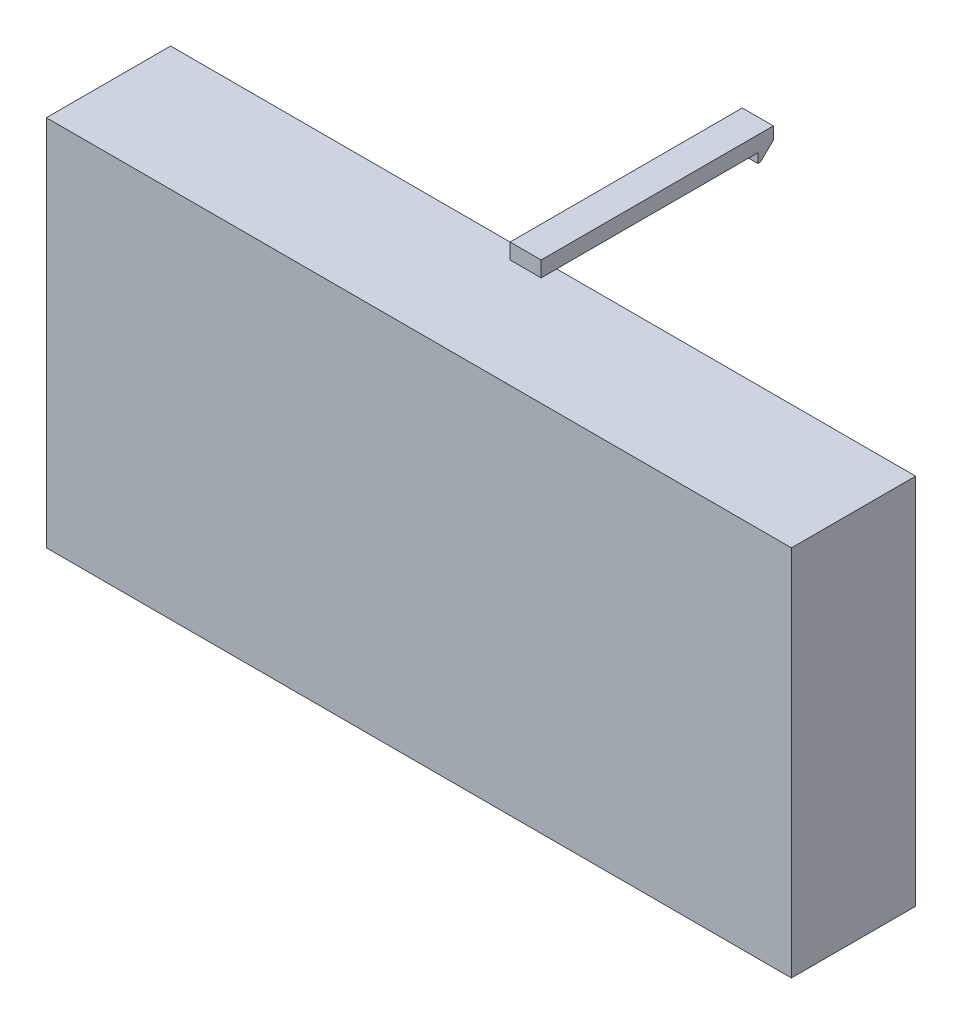
ISO-10303-21;
HEADER;
FILE_DESCRIPTION(('STEP AP214'),'2;1');
FILE_NAME('part.step','',(''),(''),'','','');
FILE_SCHEMA(('AUTOMOTIVE_DESIGN { 1 0 10303 214 1 1 1 1 }'));
ENDSEC;
DATA;
#1=APPLICATION_CONTEXT('core data for automotive mechanical design processes');
#2=APPLICATION_PROTOCOL_DEFINITION('international standard','automotive_design',2000,#1);
#3=PRODUCT_CONTEXT('',#1,'mechanical');
#4=PRODUCT('Part','Part','',(#3));
#5=PRODUCT_RELATED_PRODUCT_CATEGORY('part','',(#4));
#6=PRODUCT_DEFINITION_FORMATION('','',#4);
#7=PRODUCT_DEFINITION_CONTEXT('part definition',#1,'design');
#8=PRODUCT_DEFINITION('design','',#6,#7);
#9=PRODUCT_DEFINITION_SHAPE('','',#8);
#10=(LENGTH_UNIT() NAMED_UNIT(*) SI_UNIT(.MILLI.,.METRE.));
#11=(NAMED_UNIT(*) PLANE_ANGLE_UNIT() SI_UNIT($,.RADIAN.));
#12=(NAMED_UNIT(*) SI_UNIT($,.STERADIAN.) SOLID_ANGLE_UNIT());
#13=UNCERTAINTY_MEASURE_WITH_UNIT(LENGTH_MEASURE(1.E-05),#10,'distance_accuracy_value','');
#14=(GEOMETRIC_REPRESENTATION_CONTEXT(3) GLOBAL_UNCERTAINTY_ASSIGNED_CONTEXT((#13)) GLOBAL_UNIT_ASSIGNED_CONTEXT((#10,
#11,#12)) REPRESENTATION_CONTEXT('',''));
#15=CARTESIAN_POINT('',(0.,0.,0.));
#16=DIRECTION('',(0.,0.,1.));
#17=DIRECTION('',(1.,0.,0.));
#18=AXIS2_PLACEMENT_3D('',#15,#16,#17);
#19=CARTESIAN_POINT('',(157.949627363011,-6.35000000000003,0.));
#20=DIRECTION('',(1.,0.,0.));
#21=DIRECTION('',(0.,1.,0.));
#22=AXIS2_PLACEMENT_3D('',#19,#20,#21);
#23=PLANE('',#22);
#24=DIRECTION('',(0.,1.,0.));
#25=VECTOR('',#24,1.);
#26=CARTESIAN_POINT('',(157.949627363011,-6.35000000000002,-88.646));
#27=LINE('',#26,#25);
#28=CARTESIAN_POINT('',(157.949627363011,-6.35000000000002,-88.646));
#29=VERTEX_POINT('',#28);
#30=CARTESIAN_POINT('',(157.949627363011,-1.27000000000002,-88.646));
#31=VERTEX_POINT('',#30);
#32=EDGE_CURVE('E225',#29,#31,#27,.T.);
#33=ORIENTED_EDGE('',*,*,#32,.T.);
#34=DIRECTION('',(0.,0.694658370458993,0.719339800338655));
#35=VECTOR('',#34,1.);
#36=CARTESIAN_POINT('',(157.949627363011,3.80999999999998,-83.3855060059439));
#37=LINE('',#36,#35);
#38=CARTESIAN_POINT('',(157.949627363011,3.80999999999998,-83.3855060059439));
#39=VERTEX_POINT('',#38);
#40=EDGE_CURVE('E208',#31,#39,#37,.T.);
#41=ORIENTED_EDGE('',*,*,#40,.T.);
#42=DIRECTION('',(0.,0.,1.));
#43=VECTOR('',#42,1.);
#44=CARTESIAN_POINT('',(157.949627363011,3.80999999999997,-88.646));
#45=LINE('',#44,#43);
#46=CARTESIAN_POINT('',(157.949627363011,3.80999999999997,-82.296));
#47=VERTEX_POINT('',#46);
#48=EDGE_CURVE('E218',#39,#47,#45,.T.);
#49=ORIENTED_EDGE('',*,*,#48,.T.);
#50=DIRECTION('',(0.,-1.,0.));
#51=VECTOR('',#50,1.);
#52=CARTESIAN_POINT('',(157.949627363011,3.80999999999997,-82.296));
#53=LINE('',#52,#51);
#54=CARTESIAN_POINT('',(157.949627363011,0.,-82.296));
#55=VERTEX_POINT('',#54);
#56=EDGE_CURVE('E228',#47,#55,#53,.T.);
#57=ORIENTED_EDGE('',*,*,#56,.T.);
#58=DIRECTION('',(0.,0.,1.));
#59=VECTOR('',#58,1.);
#60=CARTESIAN_POINT('',(157.949627363011,0.,-88.646));
#61=LINE('',#60,#59);
#62=CARTESIAN_POINT('',(157.949627363011,0.,0.));
#63=VERTEX_POINT('',#62);
#64=EDGE_CURVE('E251',#55,#63,#61,.T.);
#65=ORIENTED_EDGE('',*,*,#64,.T.);
#66=DIRECTION('',(0.,0.,-1.));
#67=VECTOR('',#66,1.);
#68=CARTESIAN_POINT('',(157.949627363011,0.,0.));
#69=LINE('',#68,#67);
#70=CARTESIAN_POINT('',(157.949627363011,0.,6.35000000000003));
#71=VERTEX_POINT('',#70);
#72=EDGE_CURVE('E276',#71,#63,#69,.T.);
#73=ORIENTED_EDGE('',*,*,#72,.F.);
#74=DIRECTION('',(0.,1.,0.));
#75=VECTOR('',#74,1.);
#76=CARTESIAN_POINT('',(157.949627363011,-6.35000000000003,6.35000000000003));
#77=LINE('',#76,#75);
#78=CARTESIAN_POINT('',(157.949627363011,-6.35000000000003,6.35000000000003));
#79=VERTEX_POINT('',#78);
#80=EDGE_CURVE('E290',#79,#71,#77,.T.);
#81=ORIENTED_EDGE('',*,*,#80,.F.);
#82=DIRECTION('',(0.,0.,-1.));
#83=VECTOR('',#82,1.);
#84=CARTESIAN_POINT('',(157.949627363011,-6.35000000000003,0.));
#85=LINE('',#84,#83);
#86=EDGE_CURVE('E270',#79,#29,#85,.T.);
#87=ORIENTED_EDGE('',*,*,#86,.T.);
#88=EDGE_LOOP('',(#33,#41,#49,#57,#65,#73,#81,#87));
#89=FACE_BOUND('',#88,.T.);
#90=ADVANCED_FACE('F44',(#89),#23,.T.);
#91=CARTESIAN_POINT('',(0.,152.4,-88.646));
#92=DIRECTION('',(0.,0.,-1.));
#93=DIRECTION('',(-1.,0.,0.));
#94=AXIS2_PLACEMENT_3D('',#91,#92,#93);
#95=PLANE('',#94);
#96=DIRECTION('',(0.,-1.,0.));
#97=VECTOR('',#96,1.);
#98=CARTESIAN_POINT('',(145.249627363011,-6.35000000000002,-88.646));
#99=LINE('',#98,#97);
#100=CARTESIAN_POINT('',(145.249627363011,-1.27000000000002,-88.646));
#101=VERTEX_POINT('',#100);
#102=CARTESIAN_POINT('',(145.249627363011,-6.35000000000002,-88.646));
#103=VERTEX_POINT('',#102);
#104=EDGE_CURVE('E247',#101,#103,#99,.T.);
#105=ORIENTED_EDGE('',*,*,#104,.F.);
#106=DIRECTION('',(1.,0.,0.));
#107=VECTOR('',#106,1.);
#108=CARTESIAN_POINT('',(-0.00100000000002876,-1.26999999999999,-88.646));
#109=LINE('',#108,#107);
#110=EDGE_CURVE('E214',#101,#31,#109,.T.);
#111=ORIENTED_EDGE('',*,*,#110,.T.);
#112=ORIENTED_EDGE('',*,*,#32,.F.);
#113=DIRECTION('',(1.,0.,0.));
#114=VECTOR('',#113,1.);
#115=CARTESIAN_POINT('',(157.949627363011,-6.35000000000002,-88.646));
#116=LINE('',#115,#114);
#117=EDGE_CURVE('E249',#103,#29,#116,.T.);
#118=ORIENTED_EDGE('',*,*,#117,.F.);
#119=EDGE_LOOP('',(#105,#111,#112,#118));
#120=FACE_BOUND('',#119,.T.);
#121=ADVANCED_FACE('F523',(#120),#95,.T.);
#122=CARTESIAN_POINT('',(0.,3.81,0.));
#123=DIRECTION('',(0.,-1.,0.));
#124=DIRECTION('',(0.,0.,1.));
#125=AXIS2_PLACEMENT_3D('',#122,#123,#124);
#126=PLANE('',#125);
#127=DIRECTION('',(1.,0.,0.));
#128=VECTOR('',#127,1.);
#129=CARTESIAN_POINT('',(-0.00100000000002876,3.81000000000001,-83.3855060059439));
#130=LINE('',#129,#128);
#131=CARTESIAN_POINT('',(145.249627363011,3.80999999999997,-83.3855060059439));
#132=VERTEX_POINT('',#131);
#133=EDGE_CURVE('E202',#132,#39,#130,.T.);
#134=ORIENTED_EDGE('',*,*,#133,.F.);
#135=DIRECTION('',(0.,0.,-1.));
#136=VECTOR('',#135,1.);
#137=CARTESIAN_POINT('',(145.249627363011,3.80999999999997,-88.646));
#138=LINE('',#137,#136);
#139=CARTESIAN_POINT('',(145.249627363011,3.80999999999997,-82.296));
#140=VERTEX_POINT('',#139);
#141=EDGE_CURVE('E233',#140,#132,#138,.T.);
#142=ORIENTED_EDGE('',*,*,#141,.F.);
#143=DIRECTION('',(-1.,0.,0.));
#144=VECTOR('',#143,1.);
#145=CARTESIAN_POINT('',(145.249627363011,3.80999999999997,-82.296));
#146=LINE('',#145,#144);
#147=EDGE_CURVE('E226',#47,#140,#146,.T.);
#148=ORIENTED_EDGE('',*,*,#147,.F.);
#149=ORIENTED_EDGE('',*,*,#48,.F.);
#150=EDGE_LOOP('',(#134,#142,#148,#149));
#151=FACE_BOUND('',#150,.T.);
#152=ADVANCED_FACE('F229',(#151),#126,.F.);
#153=CARTESIAN_POINT('',(157.949627363011,0.,-88.646));
#154=DIRECTION('',(0.,1.,0.));
#155=DIRECTION('',(-1.,0.,0.));
#156=AXIS2_PLACEMENT_3D('',#153,#154,#155);
#157=PLANE('',#156);
#158=ORIENTED_EDGE('',*,*,#64,.F.);
#159=DIRECTION('',(-1.,0.,0.));
#160=VECTOR('',#159,1.);
#161=CARTESIAN_POINT('',(145.249627363011,0.,-82.296));
#162=LINE('',#161,#160);
#163=CARTESIAN_POINT('',(145.249627363011,0.,-82.296));
#164=VERTEX_POINT('',#163);
#165=EDGE_CURVE('E236',#55,#164,#162,.T.);
#166=ORIENTED_EDGE('',*,*,#165,.T.);
#167=DIRECTION('',(0.,0.,1.));
#168=VECTOR('',#167,1.);
#169=CARTESIAN_POINT('',(145.249627363011,0.,-88.646));
#170=LINE('',#169,#168);
#171=CARTESIAN_POINT('',(145.249627363011,0.,0.));
#172=VERTEX_POINT('',#171);
#173=EDGE_CURVE('E259',#164,#172,#170,.T.);
#174=ORIENTED_EDGE('',*,*,#173,.T.);
#175=DIRECTION('',(-1.,0.,0.));
#176=VECTOR('',#175,1.);
#177=CARTESIAN_POINT('',(157.949627363011,0.,0.));
#178=LINE('',#177,#176);
#179=EDGE_CURVE('E245',#63,#172,#178,.T.);
#180=ORIENTED_EDGE('',*,*,#179,.F.);
#181=EDGE_LOOP('',(#158,#166,#174,#180));
#182=FACE_BOUND('',#181,.T.);
#183=ADVANCED_FACE('F580',(#182),#157,.T.);
#184=CARTESIAN_POINT('',(0.,0.,0.));
#185=DIRECTION('',(0.,0.,-1.));
#186=DIRECTION('',(-1.,0.,0.));
#187=AXIS2_PLACEMENT_3D('',#184,#185,#186);
#188=PLANE('',#187);
#189=DIRECTION('',(-1.,0.,0.));
#190=VECTOR('',#189,1.);
#191=CARTESIAN_POINT('',(0.,149.225,0.));
#192=LINE('',#191,#190);
#193=CARTESIAN_POINT('',(301.625,149.225,0.));
#194=VERTEX_POINT('',#193);
#195=CARTESIAN_POINT('',(3.175,149.225,0.));
#196=VERTEX_POINT('',#195);
#197=EDGE_CURVE('E386',#194,#196,#192,.T.);
#198=ORIENTED_EDGE('',*,*,#197,.T.);
#199=DIRECTION('',(0.,-1.,0.));
#200=VECTOR('',#199,1.);
#201=CARTESIAN_POINT('',(3.175,0.,0.));
#202=LINE('',#201,#200);
#203=CARTESIAN_POINT('',(3.175,3.175,0.));
#204=VERTEX_POINT('',#203);
#205=EDGE_CURVE('E380',#196,#204,#202,.T.);
#206=ORIENTED_EDGE('',*,*,#205,.T.);
#207=DIRECTION('',(1.,0.,0.));
#208=VECTOR('',#207,1.);
#209=CARTESIAN_POINT('',(0.,3.175,0.));
#210=LINE('',#209,#208);
#211=CARTESIAN_POINT('',(301.625,3.175,0.));
#212=VERTEX_POINT('',#211);
#213=EDGE_CURVE('E407',#204,#212,#210,.T.);
#214=ORIENTED_EDGE('',*,*,#213,.T.);
#215=DIRECTION('',(0.,1.,0.));
#216=VECTOR('',#215,1.);
#217=CARTESIAN_POINT('',(301.625,0.,0.));
#218=LINE('',#217,#216);
#219=EDGE_CURVE('E413',#212,#194,#218,.T.);
#220=ORIENTED_EDGE('',*,*,#219,.T.);
#221=EDGE_LOOP('',(#198,#206,#214,#220));
#222=FACE_BOUND('',#221,.T.);
#223=DIRECTION('',(1.,0.,0.));
#224=VECTOR('',#223,1.);
#225=CARTESIAN_POINT('',(0.,0.,0.));
#226=LINE('',#225,#224);
#227=CARTESIAN_POINT('',(304.8,0.,0.));
#228=VERTEX_POINT('',#227);
#229=EDGE_CURVE('E438',#63,#228,#226,.T.);
#230=ORIENTED_EDGE('',*,*,#229,.F.);
#231=ORIENTED_EDGE('',*,*,#179,.T.);
#232=CARTESIAN_POINT('',(0.,0.,0.));
#233=VERTEX_POINT('',#232);
#234=EDGE_CURVE('E439',#233,#172,#226,.T.);
#235=ORIENTED_EDGE('',*,*,#234,.F.);
#236=DIRECTION('',(0.,-1.,0.));
#237=VECTOR('',#236,1.);
#238=CARTESIAN_POINT('',(0.,0.,0.));
#239=LINE('',#238,#237);
#240=CARTESIAN_POINT('',(0.,152.4,0.));
#241=VERTEX_POINT('',#240);
#242=EDGE_CURVE('E385',#241,#233,#239,.T.);
#243=ORIENTED_EDGE('',*,*,#242,.F.);
#244=DIRECTION('',(-1.,0.,0.));
#245=VECTOR('',#244,1.);
#246=CARTESIAN_POINT('',(0.,152.4,0.));
#247=LINE('',#246,#245);
#248=CARTESIAN_POINT('',(145.249627363011,152.4,0.));
#249=VERTEX_POINT('',#248);
#250=EDGE_CURVE('E446',#249,#241,#247,.T.);
#251=ORIENTED_EDGE('',*,*,#250,.F.);
#252=DIRECTION('',(-1.,0.,0.));
#253=VECTOR('',#252,1.);
#254=CARTESIAN_POINT('',(157.949627363011,152.4,0.));
#255=LINE('',#254,#253);
#256=CARTESIAN_POINT('',(157.949627363011,152.4,0.));
#257=VERTEX_POINT('',#256);
#258=EDGE_CURVE('E326',#257,#249,#255,.T.);
#259=ORIENTED_EDGE('',*,*,#258,.F.);
#260=CARTESIAN_POINT('',(304.8,152.4,0.));
#261=VERTEX_POINT('',#260);
#262=EDGE_CURVE('E426',#261,#257,#247,.T.);
#263=ORIENTED_EDGE('',*,*,#262,.F.);
#264=DIRECTION('',(0.,1.,0.));
#265=VECTOR('',#264,1.);
#266=CARTESIAN_POINT('',(304.8,0.,0.));
#267=LINE('',#266,#265);
#268=EDGE_CURVE('E441',#228,#261,#267,.T.);
#269=ORIENTED_EDGE('',*,*,#268,.F.);
#270=EDGE_LOOP('',(#230,#231,#235,#243,#251,#259,#263,#269));
#271=FACE_BOUND('',#270,.T.);
#272=ADVANCED_FACE('F468',(#222,#271),#188,.T.);
#273=CARTESIAN_POINT('',(145.249627363011,158.75,0.));
#274=DIRECTION('',(1.,0.,0.));
#275=DIRECTION('',(0.,0.,-1.));
#276=AXIS2_PLACEMENT_3D('',#273,#274,#275);
#277=PLANE('',#276);
#278=DIRECTION('',(0.,0.694658370458994,-0.719339800338655));
#279=VECTOR('',#278,1.);
#280=CARTESIAN_POINT('',(145.249627363011,148.59,-83.3855060059439));
#281=LINE('',#280,#279);
#282=CARTESIAN_POINT('',(145.249627363011,148.59,-83.3855060059439));
#283=VERTEX_POINT('',#282);
#284=CARTESIAN_POINT('',(145.249627363011,153.67,-88.646));
#285=VERTEX_POINT('',#284);
#286=EDGE_CURVE('E292',#283,#285,#281,.T.);
#287=ORIENTED_EDGE('',*,*,#286,.F.);
#288=DIRECTION('',(0.,0.,-1.));
#289=VECTOR('',#288,1.);
#290=CARTESIAN_POINT('',(145.249627363011,148.59,-88.646));
#291=LINE('',#290,#289);
#292=CARTESIAN_POINT('',(145.249627363011,148.59,-82.296));
#293=VERTEX_POINT('',#292);
#294=EDGE_CURVE('E302',#293,#283,#291,.T.);
#295=ORIENTED_EDGE('',*,*,#294,.F.);
#296=DIRECTION('',(0.,1.,0.));
#297=VECTOR('',#296,1.);
#298=CARTESIAN_POINT('',(145.249627363011,148.59,-82.296));
#299=LINE('',#298,#297);
#300=CARTESIAN_POINT('',(145.249627363011,152.4,-82.296));
#301=VERTEX_POINT('',#300);
#302=EDGE_CURVE('E312',#293,#301,#299,.T.);
#303=ORIENTED_EDGE('',*,*,#302,.T.);
#304=DIRECTION('',(0.,0.,1.));
#305=VECTOR('',#304,1.);
#306=CARTESIAN_POINT('',(145.249627363011,152.4,-88.646));
#307=LINE('',#306,#305);
#308=EDGE_CURVE('E340',#301,#249,#307,.T.);
#309=ORIENTED_EDGE('',*,*,#308,.T.);
#310=DIRECTION('',(0.,0.,1.));
#311=VECTOR('',#310,1.);
#312=CARTESIAN_POINT('',(145.249627363011,152.4,0.));
#313=LINE('',#312,#311);
#314=CARTESIAN_POINT('',(145.249627363011,152.4,6.35000000000003));
#315=VERTEX_POINT('',#314);
#316=EDGE_CURVE('E350',#249,#315,#313,.T.);
#317=ORIENTED_EDGE('',*,*,#316,.T.);
#318=DIRECTION('',(0.,-1.,0.));
#319=VECTOR('',#318,1.);
#320=CARTESIAN_POINT('',(145.249627363011,158.75,6.35000000000003));
#321=LINE('',#320,#319);
#322=CARTESIAN_POINT('',(145.249627363011,158.75,6.35000000000003));
#323=VERTEX_POINT('',#322);
#324=EDGE_CURVE('E373',#323,#315,#321,.T.);
#325=ORIENTED_EDGE('',*,*,#324,.F.);
#326=DIRECTION('',(0.,0.,1.));
#327=VECTOR('',#326,1.);
#328=CARTESIAN_POINT('',(145.249627363011,158.75,0.));
#329=LINE('',#328,#327);
#330=CARTESIAN_POINT('',(145.249627363011,158.75,-88.646));
#331=VERTEX_POINT('',#330);
#332=EDGE_CURVE('E346',#331,#323,#329,.T.);
#333=ORIENTED_EDGE('',*,*,#332,.F.);
#334=DIRECTION('',(0.,1.,0.));
#335=VECTOR('',#334,1.);
#336=CARTESIAN_POINT('',(145.249627363011,158.75,-88.646));
#337=LINE('',#336,#335);
#338=EDGE_CURVE('E332',#285,#331,#337,.T.);
#339=ORIENTED_EDGE('',*,*,#338,.F.);
#340=EDGE_LOOP('',(#287,#295,#303,#309,#317,#325,#333,#339));
#341=FACE_BOUND('',#340,.T.);
#342=ADVANCED_FACE('F500',(#341),#277,.F.);
#343=CARTESIAN_POINT('',(157.949627363011,158.75,0.));
#344=DIRECTION('',(-1.,0.,0.));
#345=DIRECTION('',(0.,0.,1.));
#346=AXIS2_PLACEMENT_3D('',#343,#344,#345);
#347=PLANE('',#346);
#348=DIRECTION('',(0.,-0.694658370458993,0.719339800338655));
#349=VECTOR('',#348,1.);
#350=CARTESIAN_POINT('',(157.949627363011,148.59,-83.3855060059439));
#351=LINE('',#350,#349);
#352=CARTESIAN_POINT('',(157.949627363011,153.67,-88.646));
#353=VERTEX_POINT('',#352);
#354=CARTESIAN_POINT('',(157.949627363011,148.59,-83.3855060059439));
#355=VERTEX_POINT('',#354);
#356=EDGE_CURVE('E294',#353,#355,#351,.T.);
#357=ORIENTED_EDGE('',*,*,#356,.F.);
#358=DIRECTION('',(0.,-1.,0.));
#359=VECTOR('',#358,1.);
#360=CARTESIAN_POINT('',(157.949627363011,158.75,-88.646));
#361=LINE('',#360,#359);
#362=CARTESIAN_POINT('',(157.949627363011,158.75,-88.646));
#363=VERTEX_POINT('',#362);
#364=EDGE_CURVE('E330',#363,#353,#361,.T.);
#365=ORIENTED_EDGE('',*,*,#364,.F.);
#366=DIRECTION('',(0.,0.,-1.));
#367=VECTOR('',#366,1.);
#368=CARTESIAN_POINT('',(157.949627363011,158.75,0.));
#369=LINE('',#368,#367);
#370=CARTESIAN_POINT('',(157.949627363011,158.75,6.35000000000003));
#371=VERTEX_POINT('',#370);
#372=EDGE_CURVE('E359',#371,#363,#369,.T.);
#373=ORIENTED_EDGE('',*,*,#372,.F.);
#374=DIRECTION('',(0.,-1.,0.));
#375=VECTOR('',#374,1.);
#376=CARTESIAN_POINT('',(157.949627363011,158.75,6.35000000000003));
#377=LINE('',#376,#375);
#378=CARTESIAN_POINT('',(157.949627363011,152.4,6.35000000000003));
#379=VERTEX_POINT('',#378);
#380=EDGE_CURVE('E358',#371,#379,#377,.T.);
#381=ORIENTED_EDGE('',*,*,#380,.T.);
#382=DIRECTION('',(0.,0.,-1.));
#383=VECTOR('',#382,1.);
#384=CARTESIAN_POINT('',(157.949627363011,152.4,0.));
#385=LINE('',#384,#383);
#386=EDGE_CURVE('E355',#379,#257,#385,.T.);
#387=ORIENTED_EDGE('',*,*,#386,.T.);
#388=DIRECTION('',(0.,0.,1.));
#389=VECTOR('',#388,1.);
#390=CARTESIAN_POINT('',(157.949627363011,152.4,-88.646));
#391=LINE('',#390,#389);
#392=CARTESIAN_POINT('',(157.949627363011,152.4,-82.296));
#393=VERTEX_POINT('',#392);
#394=EDGE_CURVE('E343',#393,#257,#391,.T.);
#395=ORIENTED_EDGE('',*,*,#394,.F.);
#396=DIRECTION('',(0.,1.,0.));
#397=VECTOR('',#396,1.);
#398=CARTESIAN_POINT('',(157.949627363011,148.59,-82.296));
#399=LINE('',#398,#397);
#400=CARTESIAN_POINT('',(157.949627363011,148.59,-82.296));
#401=VERTEX_POINT('',#400);
#402=EDGE_CURVE('E325',#401,#393,#399,.T.);
#403=ORIENTED_EDGE('',*,*,#402,.F.);
#404=DIRECTION('',(0.,0.,1.));
#405=VECTOR('',#404,1.);
#406=CARTESIAN_POINT('',(157.949627363011,148.59,-88.646));
#407=LINE('',#406,#405);
#408=EDGE_CURVE('E310',#355,#401,#407,.T.);
#409=ORIENTED_EDGE('',*,*,#408,.F.);
#410=EDGE_LOOP('',(#357,#365,#373,#381,#387,#395,#403,#409));
#411=FACE_BOUND('',#410,.T.);
#412=ADVANCED_FACE('F479',(#411),#347,.F.);
#413=CARTESIAN_POINT('',(157.949627363011,152.4,-88.646));
#414=DIRECTION('',(0.,1.,0.));
#415=DIRECTION('',(0.,0.,1.));
#416=AXIS2_PLACEMENT_3D('',#413,#414,#415);
#417=PLANE('',#416);
#418=DIRECTION('',(-1.,0.,0.));
#419=VECTOR('',#418,1.);
#420=CARTESIAN_POINT('',(145.249627363011,152.4,-82.296));
#421=LINE('',#420,#419);
#422=EDGE_CURVE('E301',#393,#301,#421,.T.);
#423=ORIENTED_EDGE('',*,*,#422,.F.);
#424=ORIENTED_EDGE('',*,*,#394,.T.);
#425=ORIENTED_EDGE('',*,*,#258,.T.);
#426=ORIENTED_EDGE('',*,*,#308,.F.);
#427=EDGE_LOOP('',(#423,#424,#425,#426));
#428=FACE_BOUND('',#427,.T.);
#429=ADVANCED_FACE('F489',(#428),#417,.F.);
#430=CARTESIAN_POINT('',(0.,152.4,50.8));
#431=DIRECTION('',(0.,-1.,0.));
#432=DIRECTION('',(0.,0.,-1.));
#433=AXIS2_PLACEMENT_3D('',#430,#431,#432);
#434=PLANE('',#433);
#435=ORIENTED_EDGE('',*,*,#316,.F.);
#436=ORIENTED_EDGE('',*,*,#250,.T.);
#437=DIRECTION('',(0.,0.,-1.));
#438=VECTOR('',#437,1.);
#439=CARTESIAN_POINT('',(0.,152.4,50.8));
#440=LINE('',#439,#438);
#441=CARTESIAN_POINT('',(0.,152.4,50.8));
#442=VERTEX_POINT('',#441);
#443=EDGE_CURVE('E434',#442,#241,#440,.T.);
#444=ORIENTED_EDGE('',*,*,#443,.F.);
#445=DIRECTION('',(-1.,0.,0.));
#446=VECTOR('',#445,1.);
#447=CARTESIAN_POINT('',(0.,152.4,50.8));
#448=LINE('',#447,#446);
#449=CARTESIAN_POINT('',(304.8,152.4,50.8));
#450=VERTEX_POINT('',#449);
#451=EDGE_CURVE('E435',#450,#442,#448,.T.);
#452=ORIENTED_EDGE('',*,*,#451,.F.);
#453=DIRECTION('',(0.,0.,-1.));
#454=VECTOR('',#453,1.);
#455=CARTESIAN_POINT('',(304.8,152.4,50.8));
#456=LINE('',#455,#454);
#457=EDGE_CURVE('E453',#450,#261,#456,.T.);
#458=ORIENTED_EDGE('',*,*,#457,.T.);
#459=ORIENTED_EDGE('',*,*,#262,.T.);
#460=ORIENTED_EDGE('',*,*,#386,.F.);
#461=DIRECTION('',(1.,0.,0.));
#462=VECTOR('',#461,1.);
#463=CARTESIAN_POINT('',(145.249627363011,152.4,6.35000000000003));
#464=LINE('',#463,#462);
#465=EDGE_CURVE('E361',#315,#379,#464,.T.);
#466=ORIENTED_EDGE('',*,*,#465,.F.);
#467=EDGE_LOOP('',(#435,#436,#444,#452,#458,#459,#460,#466));
#468=FACE_BOUND('',#467,.T.);
#469=ADVANCED_FACE('F475',(#468),#434,.F.);
#470=CARTESIAN_POINT('',(0.,0.,50.8));
#471=DIRECTION('',(1.,0.,0.));
#472=DIRECTION('',(0.,0.,-1.));
#473=AXIS2_PLACEMENT_3D('',#470,#471,#472);
#474=PLANE('',#473);
#475=ORIENTED_EDGE('',*,*,#242,.T.);
#476=DIRECTION('',(0.,0.,-1.));
#477=VECTOR('',#476,1.);
#478=CARTESIAN_POINT('',(0.,0.,50.8));
#479=LINE('',#478,#477);
#480=CARTESIAN_POINT('',(0.,0.,50.8));
#481=VERTEX_POINT('',#480);
#482=EDGE_CURVE('E11',#481,#233,#479,.T.);
#483=ORIENTED_EDGE('',*,*,#482,.F.);
#484=DIRECTION('',(0.,-1.,0.));
#485=VECTOR('',#484,1.);
#486=CARTESIAN_POINT('',(0.,0.,50.8));
#487=LINE('',#486,#485);
#488=EDGE_CURVE('E423',#442,#481,#487,.T.);
#489=ORIENTED_EDGE('',*,*,#488,.F.);
#490=ORIENTED_EDGE('',*,*,#443,.T.);
#491=EDGE_LOOP('',(#475,#483,#489,#490));
#492=FACE_BOUND('',#491,.T.);
#493=ADVANCED_FACE('F50',(#492),#474,.F.);
#494=CARTESIAN_POINT('',(0.,0.,50.8));
#495=DIRECTION('',(0.,1.,0.));
#496=DIRECTION('',(0.,0.,1.));
#497=AXIS2_PLACEMENT_3D('',#494,#495,#496);
#498=PLANE('',#497);
#499=ORIENTED_EDGE('',*,*,#234,.T.);
#500=DIRECTION('',(0.,0.,1.));
#501=VECTOR('',#500,1.);
#502=CARTESIAN_POINT('',(145.249627363011,0.,0.));
#503=LINE('',#502,#501);
#504=CARTESIAN_POINT('',(145.249627363011,0.,6.35000000000003));
#505=VERTEX_POINT('',#504);
#506=EDGE_CURVE('E265',#172,#505,#503,.T.);
#507=ORIENTED_EDGE('',*,*,#506,.T.);
#508=DIRECTION('',(1.,0.,0.));
#509=VECTOR('',#508,1.);
#510=CARTESIAN_POINT('',(145.249627363011,0.,6.35000000000003));
#511=LINE('',#510,#509);
#512=EDGE_CURVE('E268',#505,#71,#511,.T.);
#513=ORIENTED_EDGE('',*,*,#512,.T.);
#514=ORIENTED_EDGE('',*,*,#72,.T.);
#515=ORIENTED_EDGE('',*,*,#229,.T.);
#516=DIRECTION('',(0.,0.,-1.));
#517=VECTOR('',#516,1.);
#518=CARTESIAN_POINT('',(304.8,0.,50.8));
#519=LINE('',#518,#517);
#520=CARTESIAN_POINT('',(304.8,0.,50.8));
#521=VERTEX_POINT('',#520);
#522=EDGE_CURVE('E53',#521,#228,#519,.T.);
#523=ORIENTED_EDGE('',*,*,#522,.F.);
#524=DIRECTION('',(1.,0.,0.));
#525=VECTOR('',#524,1.);
#526=CARTESIAN_POINT('',(0.,0.,50.8));
#527=LINE('',#526,#525);
#528=EDGE_CURVE('E422',#481,#521,#527,.T.);
#529=ORIENTED_EDGE('',*,*,#528,.F.);
#530=ORIENTED_EDGE('',*,*,#482,.T.);
#531=EDGE_LOOP('',(#499,#507,#513,#514,#515,#523,#529,#530));
#532=FACE_BOUND('',#531,.T.);
#533=ADVANCED_FACE('F582',(#532),#498,.F.);
#534=CARTESIAN_POINT('',(304.8,0.,50.8));
#535=DIRECTION('',(-1.,0.,0.));
#536=DIRECTION('',(0.,0.,1.));
#537=AXIS2_PLACEMENT_3D('',#534,#535,#536);
#538=PLANE('',#537);
#539=ORIENTED_EDGE('',*,*,#268,.T.);
#540=ORIENTED_EDGE('',*,*,#457,.F.);
#541=DIRECTION('',(0.,1.,0.));
#542=VECTOR('',#541,1.);
#543=CARTESIAN_POINT('',(304.8,0.,50.8));
#544=LINE('',#543,#542);
#545=EDGE_CURVE('E427',#521,#450,#544,.T.);
#546=ORIENTED_EDGE('',*,*,#545,.F.);
#547=ORIENTED_EDGE('',*,*,#522,.T.);
#548=EDGE_LOOP('',(#539,#540,#546,#547));
#549=FACE_BOUND('',#548,.T.);
#550=ADVANCED_FACE('F465',(#549),#538,.F.);
#551=CARTESIAN_POINT('',(0.,0.,50.8));
#552=DIRECTION('',(0.,0.,-1.));
#553=DIRECTION('',(-1.,0.,0.));
#554=AXIS2_PLACEMENT_3D('',#551,#552,#553);
#555=PLANE('',#554);
#556=ORIENTED_EDGE('',*,*,#488,.T.);
#557=ORIENTED_EDGE('',*,*,#528,.T.);
#558=ORIENTED_EDGE('',*,*,#545,.T.);
#559=ORIENTED_EDGE('',*,*,#451,.T.);
#560=EDGE_LOOP('',(#556,#557,#558,#559));
#561=FACE_BOUND('',#560,.T.);
#562=ADVANCED_FACE('F560',(#561),#555,.F.);
#563=CARTESIAN_POINT('',(3.175,0.,50.8));
#564=DIRECTION('',(1.,0.,0.));
#565=DIRECTION('',(0.,0.,-1.));
#566=AXIS2_PLACEMENT_3D('',#563,#564,#565);
#567=PLANE('',#566);
#568=ORIENTED_EDGE('',*,*,#205,.F.);
#569=DIRECTION('',(0.,0.,-1.));
#570=VECTOR('',#569,1.);
#571=CARTESIAN_POINT('',(3.175,149.225,50.8));
#572=LINE('',#571,#570);
#573=CARTESIAN_POINT('',(3.175,149.225,47.625));
#574=VERTEX_POINT('',#573);
#575=EDGE_CURVE('E388',#574,#196,#572,.T.);
#576=ORIENTED_EDGE('',*,*,#575,.F.);
#577=DIRECTION('',(0.,-1.,0.));
#578=VECTOR('',#577,1.);
#579=CARTESIAN_POINT('',(3.175,0.,47.625));
#580=LINE('',#579,#578);
#581=CARTESIAN_POINT('',(3.175,3.175,47.625));
#582=VERTEX_POINT('',#581);
#583=EDGE_CURVE('E383',#574,#582,#580,.T.);
#584=ORIENTED_EDGE('',*,*,#583,.T.);
#585=DIRECTION('',(0.,0.,-1.));
#586=VECTOR('',#585,1.);
#587=CARTESIAN_POINT('',(3.175,3.175,50.8));
#588=LINE('',#587,#586);
#589=EDGE_CURVE('E378',#582,#204,#588,.T.);
#590=ORIENTED_EDGE('',*,*,#589,.T.);
#591=EDGE_LOOP('',(#568,#576,#584,#590));
#592=FACE_BOUND('',#591,.T.);
#593=ADVANCED_FACE('F551',(#592),#567,.T.);
#594=CARTESIAN_POINT('',(0.,3.175,50.8));
#595=DIRECTION('',(0.,1.,0.));
#596=DIRECTION('',(0.,0.,1.));
#597=AXIS2_PLACEMENT_3D('',#594,#595,#596);
#598=PLANE('',#597);
#599=ORIENTED_EDGE('',*,*,#213,.F.);
#600=ORIENTED_EDGE('',*,*,#589,.F.);
#601=DIRECTION('',(1.,0.,0.));
#602=VECTOR('',#601,1.);
#603=CARTESIAN_POINT('',(0.,3.175,47.625));
#604=LINE('',#603,#602);
#605=CARTESIAN_POINT('',(301.625,3.175,47.625));
#606=VERTEX_POINT('',#605);
#607=EDGE_CURVE('E389',#582,#606,#604,.T.);
#608=ORIENTED_EDGE('',*,*,#607,.T.);
#609=DIRECTION('',(0.,0.,-1.));
#610=VECTOR('',#609,1.);
#611=CARTESIAN_POINT('',(301.625,3.175,50.8));
#612=LINE('',#611,#610);
#613=EDGE_CURVE('E382',#606,#212,#612,.T.);
#614=ORIENTED_EDGE('',*,*,#613,.T.);
#615=EDGE_LOOP('',(#599,#600,#608,#614));
#616=FACE_BOUND('',#615,.T.);
#617=ADVANCED_FACE('F556',(#616),#598,.T.);
#618=CARTESIAN_POINT('',(301.625,0.,50.8));
#619=DIRECTION('',(-1.,0.,0.));
#620=DIRECTION('',(0.,0.,1.));
#621=AXIS2_PLACEMENT_3D('',#618,#619,#620);
#622=PLANE('',#621);
#623=ORIENTED_EDGE('',*,*,#219,.F.);
#624=ORIENTED_EDGE('',*,*,#613,.F.);
#625=DIRECTION('',(0.,1.,0.));
#626=VECTOR('',#625,1.);
#627=CARTESIAN_POINT('',(301.625,0.,47.625));
#628=LINE('',#627,#626);
#629=CARTESIAN_POINT('',(301.625,149.225,47.625));
#630=VERTEX_POINT('',#629);
#631=EDGE_CURVE('E397',#606,#630,#628,.T.);
#632=ORIENTED_EDGE('',*,*,#631,.T.);
#633=DIRECTION('',(0.,0.,-1.));
#634=VECTOR('',#633,1.);
#635=CARTESIAN_POINT('',(301.625,149.225,50.8));
#636=LINE('',#635,#634);
#637=EDGE_CURVE('E395',#630,#194,#636,.T.);
#638=ORIENTED_EDGE('',*,*,#637,.T.);
#639=EDGE_LOOP('',(#623,#624,#632,#638));
#640=FACE_BOUND('',#639,.T.);
#641=ADVANCED_FACE('F561',(#640),#622,.T.);
#642=CARTESIAN_POINT('',(0.,149.225,50.8));
#643=DIRECTION('',(0.,-1.,0.));
#644=DIRECTION('',(0.,0.,-1.));
#645=AXIS2_PLACEMENT_3D('',#642,#643,#644);
#646=PLANE('',#645);
#647=ORIENTED_EDGE('',*,*,#197,.F.);
#648=ORIENTED_EDGE('',*,*,#637,.F.);
#649=DIRECTION('',(-1.,0.,0.));
#650=VECTOR('',#649,1.);
#651=CARTESIAN_POINT('',(0.,149.225,47.625));
#652=LINE('',#651,#650);
#653=EDGE_CURVE('E393',#630,#574,#652,.T.);
#654=ORIENTED_EDGE('',*,*,#653,.T.);
#655=ORIENTED_EDGE('',*,*,#575,.T.);
#656=EDGE_LOOP('',(#647,#648,#654,#655));
#657=FACE_BOUND('',#656,.T.);
#658=ADVANCED_FACE('F567',(#657),#646,.T.);
#659=CARTESIAN_POINT('',(0.,0.,47.625));
#660=DIRECTION('',(0.,0.,-1.));
#661=DIRECTION('',(-1.,0.,0.));
#662=AXIS2_PLACEMENT_3D('',#659,#660,#661);
#663=PLANE('',#662);
#664=ORIENTED_EDGE('',*,*,#583,.F.);
#665=ORIENTED_EDGE('',*,*,#653,.F.);
#666=ORIENTED_EDGE('',*,*,#631,.F.);
#667=ORIENTED_EDGE('',*,*,#607,.F.);
#668=EDGE_LOOP('',(#664,#665,#666,#667));
#669=FACE_BOUND('',#668,.T.);
#670=ADVANCED_FACE('F518',(#669),#663,.T.);
#671=CARTESIAN_POINT('',(145.249627363011,158.75,6.35000000000003));
#672=DIRECTION('',(0.,0.,-1.));
#673=DIRECTION('',(-1.,0.,0.));
#674=AXIS2_PLACEMENT_3D('',#671,#672,#673);
#675=PLANE('',#674);
#676=ORIENTED_EDGE('',*,*,#465,.T.);
#677=ORIENTED_EDGE('',*,*,#380,.F.);
#678=DIRECTION('',(1.,0.,0.));
#679=VECTOR('',#678,1.);
#680=CARTESIAN_POINT('',(145.249627363011,158.75,6.35000000000003));
#681=LINE('',#680,#679);
#682=EDGE_CURVE('E351',#323,#371,#681,.T.);
#683=ORIENTED_EDGE('',*,*,#682,.F.);
#684=ORIENTED_EDGE('',*,*,#324,.T.);
#685=EDGE_LOOP('',(#676,#677,#683,#684));
#686=FACE_BOUND('',#685,.T.);
#687=ADVANCED_FACE('F484',(#686),#675,.F.);
#688=CARTESIAN_POINT('',(0.,158.75,0.));
#689=DIRECTION('',(0.,1.,0.));
#690=DIRECTION('',(0.,0.,1.));
#691=AXIS2_PLACEMENT_3D('',#688,#689,#690);
#692=PLANE('',#691);
#693=ORIENTED_EDGE('',*,*,#332,.T.);
#694=ORIENTED_EDGE('',*,*,#682,.T.);
#695=ORIENTED_EDGE('',*,*,#372,.T.);
#696=DIRECTION('',(1.,0.,0.));
#697=VECTOR('',#696,1.);
#698=CARTESIAN_POINT('',(157.949627363011,158.75,-88.646));
#699=LINE('',#698,#697);
#700=EDGE_CURVE('E331',#331,#363,#699,.T.);
#701=ORIENTED_EDGE('',*,*,#700,.F.);
#702=EDGE_LOOP('',(#693,#694,#695,#701));
#703=FACE_BOUND('',#702,.T.);
#704=ADVANCED_FACE('F508',(#703),#692,.T.);
#705=CARTESIAN_POINT('',(0.,0.,-88.646));
#706=DIRECTION('',(0.,0.,-1.));
#707=DIRECTION('',(-1.,0.,0.));
#708=AXIS2_PLACEMENT_3D('',#705,#706,#707);
#709=PLANE('',#708);
#710=DIRECTION('',(1.,0.,0.));
#711=VECTOR('',#710,1.);
#712=CARTESIAN_POINT('',(-0.001000000000001,153.67,-88.646));
#713=LINE('',#712,#711);
#714=EDGE_CURVE('E296',#285,#353,#713,.T.);
#715=ORIENTED_EDGE('',*,*,#714,.F.);
#716=ORIENTED_EDGE('',*,*,#338,.T.);
#717=ORIENTED_EDGE('',*,*,#700,.T.);
#718=ORIENTED_EDGE('',*,*,#364,.T.);
#719=EDGE_LOOP('',(#715,#716,#717,#718));
#720=FACE_BOUND('',#719,.T.);
#721=ADVANCED_FACE('F502',(#720),#709,.T.);
#722=CARTESIAN_POINT('',(145.249627363011,148.59,-82.296));
#723=DIRECTION('',(0.,0.,-1.));
#724=DIRECTION('',(-1.,0.,0.));
#725=AXIS2_PLACEMENT_3D('',#722,#723,#724);
#726=PLANE('',#725);
#727=ORIENTED_EDGE('',*,*,#422,.T.);
#728=ORIENTED_EDGE('',*,*,#302,.F.);
#729=DIRECTION('',(-1.,0.,0.));
#730=VECTOR('',#729,1.);
#731=CARTESIAN_POINT('',(145.249627363011,148.59,-82.296));
#732=LINE('',#731,#730);
#733=EDGE_CURVE('E315',#401,#293,#732,.T.);
#734=ORIENTED_EDGE('',*,*,#733,.F.);
#735=ORIENTED_EDGE('',*,*,#402,.T.);
#736=EDGE_LOOP('',(#727,#728,#734,#735));
#737=FACE_BOUND('',#736,.T.);
#738=ADVANCED_FACE('F492',(#737),#726,.F.);
#739=CARTESIAN_POINT('',(0.,148.59,0.));
#740=DIRECTION('',(0.,1.,0.));
#741=DIRECTION('',(0.,0.,1.));
#742=AXIS2_PLACEMENT_3D('',#739,#740,#741);
#743=PLANE('',#742);
#744=ORIENTED_EDGE('',*,*,#294,.T.);
#745=DIRECTION('',(1.,0.,0.));
#746=VECTOR('',#745,1.);
#747=CARTESIAN_POINT('',(-0.001000000000001,148.59,-83.3855060059439));
#748=LINE('',#747,#746);
#749=EDGE_CURVE('E300',#283,#355,#748,.T.);
#750=ORIENTED_EDGE('',*,*,#749,.T.);
#751=ORIENTED_EDGE('',*,*,#408,.T.);
#752=ORIENTED_EDGE('',*,*,#733,.T.);
#753=EDGE_LOOP('',(#744,#750,#751,#752));
#754=FACE_BOUND('',#753,.T.);
#755=ADVANCED_FACE('F498',(#754),#743,.F.);
#756=CARTESIAN_POINT('',(-0.001000000000001,148.59,-83.3855060059439));
#757=DIRECTION('',(0.,0.719339800338655,0.694658370458994));
#758=DIRECTION('',(0.,-0.694658370458994,0.719339800338655));
#759=AXIS2_PLACEMENT_3D('',#756,#757,#758);
#760=PLANE('',#759);
#761=ORIENTED_EDGE('',*,*,#286,.T.);
#762=ORIENTED_EDGE('',*,*,#714,.T.);
#763=ORIENTED_EDGE('',*,*,#356,.T.);
#764=ORIENTED_EDGE('',*,*,#749,.F.);
#765=EDGE_LOOP('',(#761,#762,#763,#764));
#766=FACE_BOUND('',#765,.T.);
#767=ADVANCED_FACE('F537',(#766),#760,.F.);
#768=CARTESIAN_POINT('',(145.249627363011,-6.35000000000003,0.));
#769=DIRECTION('',(-1.,0.,0.));
#770=DIRECTION('',(0.,-1.,0.));
#771=AXIS2_PLACEMENT_3D('',#768,#769,#770);
#772=PLANE('',#771);
#773=DIRECTION('',(0.,0.694658370458994,0.719339800338655));
#774=VECTOR('',#773,1.);
#775=CARTESIAN_POINT('',(145.249627363011,3.80999999999998,-83.3855060059439));
#776=LINE('',#775,#774);
#777=EDGE_CURVE('E64',#101,#132,#776,.T.);
#778=ORIENTED_EDGE('',*,*,#777,.F.);
#779=ORIENTED_EDGE('',*,*,#104,.T.);
#780=DIRECTION('',(0.,0.,1.));
#781=VECTOR('',#780,1.);
#782=CARTESIAN_POINT('',(145.249627363011,-6.35000000000003,0.));
#783=LINE('',#782,#781);
#784=CARTESIAN_POINT('',(145.249627363011,-6.35000000000003,6.35000000000003));
#785=VERTEX_POINT('',#784);
#786=EDGE_CURVE('E263',#103,#785,#783,.T.);
#787=ORIENTED_EDGE('',*,*,#786,.T.);
#788=DIRECTION('',(0.,1.,0.));
#789=VECTOR('',#788,1.);
#790=CARTESIAN_POINT('',(145.249627363011,-6.35000000000003,6.35000000000003));
#791=LINE('',#790,#789);
#792=EDGE_CURVE('E274',#785,#505,#791,.T.);
#793=ORIENTED_EDGE('',*,*,#792,.T.);
#794=ORIENTED_EDGE('',*,*,#506,.F.);
#795=ORIENTED_EDGE('',*,*,#173,.F.);
#796=DIRECTION('',(0.,-1.,0.));
#797=VECTOR('',#796,1.);
#798=CARTESIAN_POINT('',(145.249627363011,3.80999999999997,-82.296));
#799=LINE('',#798,#797);
#800=EDGE_CURVE('E68',#140,#164,#799,.T.);
#801=ORIENTED_EDGE('',*,*,#800,.F.);
#802=ORIENTED_EDGE('',*,*,#141,.T.);
#803=EDGE_LOOP('',(#778,#779,#787,#793,#794,#795,#801,#802));
#804=FACE_BOUND('',#803,.T.);
#805=ADVANCED_FACE('F536',(#804),#772,.T.);
#806=CARTESIAN_POINT('',(145.249627363011,-6.35000000000003,6.35000000000003));
#807=DIRECTION('',(0.,0.,1.));
#808=DIRECTION('',(1.,0.,0.));
#809=AXIS2_PLACEMENT_3D('',#806,#807,#808);
#810=PLANE('',#809);
#811=ORIENTED_EDGE('',*,*,#512,.F.);
#812=ORIENTED_EDGE('',*,*,#792,.F.);
#813=DIRECTION('',(1.,0.,0.));
#814=VECTOR('',#813,1.);
#815=CARTESIAN_POINT('',(145.249627363011,-6.35000000000003,6.35000000000003));
#816=LINE('',#815,#814);
#817=EDGE_CURVE('E271',#785,#79,#816,.T.);
#818=ORIENTED_EDGE('',*,*,#817,.T.);
#819=ORIENTED_EDGE('',*,*,#80,.T.);
#820=EDGE_LOOP('',(#811,#812,#818,#819));
#821=FACE_BOUND('',#820,.T.);
#822=ADVANCED_FACE('F534',(#821),#810,.T.);
#823=CARTESIAN_POINT('',(0.,-6.35,0.));
#824=DIRECTION('',(0.,-1.,0.));
#825=DIRECTION('',(0.,0.,1.));
#826=AXIS2_PLACEMENT_3D('',#823,#824,#825);
#827=PLANE('',#826);
#828=ORIENTED_EDGE('',*,*,#786,.F.);
#829=ORIENTED_EDGE('',*,*,#117,.T.);
#830=ORIENTED_EDGE('',*,*,#86,.F.);
#831=ORIENTED_EDGE('',*,*,#817,.F.);
#832=EDGE_LOOP('',(#828,#829,#830,#831));
#833=FACE_BOUND('',#832,.T.);
#834=ADVANCED_FACE('F602',(#833),#827,.T.);
#835=CARTESIAN_POINT('',(145.249627363011,3.80999999999997,-82.296));
#836=DIRECTION('',(0.,0.,1.));
#837=DIRECTION('',(1.,0.,0.));
#838=AXIS2_PLACEMENT_3D('',#835,#836,#837);
#839=PLANE('',#838);
#840=ORIENTED_EDGE('',*,*,#165,.F.);
#841=ORIENTED_EDGE('',*,*,#56,.F.);
#842=ORIENTED_EDGE('',*,*,#147,.T.);
#843=ORIENTED_EDGE('',*,*,#800,.T.);
#844=EDGE_LOOP('',(#840,#841,#842,#843));
#845=FACE_BOUND('',#844,.T.);
#846=ADVANCED_FACE('F601',(#845),#839,.T.);
#847=CARTESIAN_POINT('',(-0.00100000000002876,3.81000000000001,-83.3855060059439));
#848=DIRECTION('',(0.,0.719339800338655,-0.694658370458994));
#849=DIRECTION('',(0.,0.694658370458994,0.719339800338655));
#850=AXIS2_PLACEMENT_3D('',#847,#848,#849);
#851=PLANE('',#850);
#852=ORIENTED_EDGE('',*,*,#777,.T.);
#853=ORIENTED_EDGE('',*,*,#133,.T.);
#854=ORIENTED_EDGE('',*,*,#40,.F.);
#855=ORIENTED_EDGE('',*,*,#110,.F.);
#856=EDGE_LOOP('',(#852,#853,#854,#855));
#857=FACE_BOUND('',#856,.T.);
#858=ADVANCED_FACE('F210',(#857),#851,.T.);
#859=CLOSED_SHELL('',(#90,#121,#152,#183,#272,#342,#412,#429,#469,#493,#533,#550,#562,#593,#617,
#641,#658,#670,#687,#704,#721,#738,#755,#767,#805,#822,#834,#846,#858));
#860=MANIFOLD_SOLID_BREP('B2',#859);
#861=ADVANCED_BREP_SHAPE_REPRESENTATION('',(#18,#860),#14);
#862=SHAPE_DEFINITION_REPRESENTATION(#9,#861);
ENDSEC;
END-ISO-10303-21;
